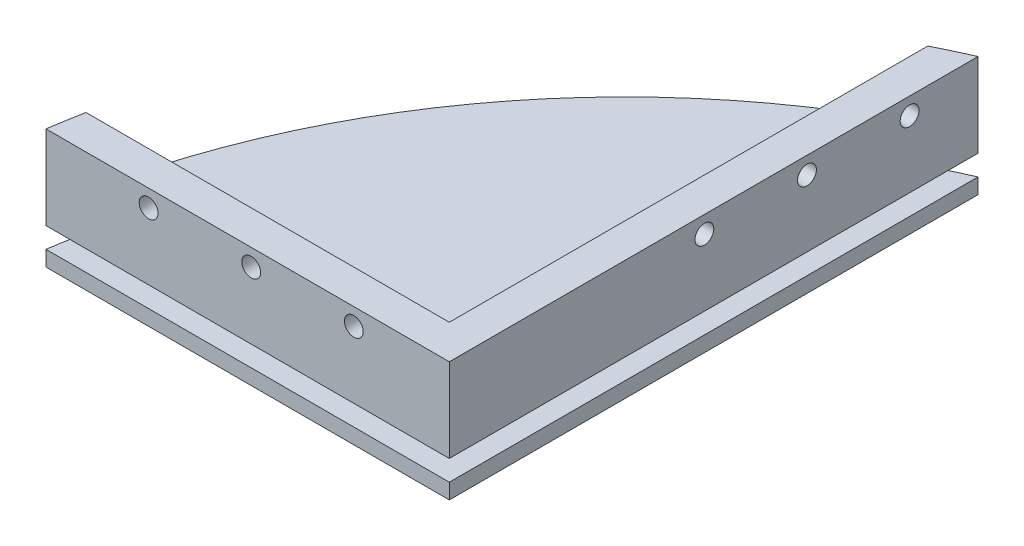
ISO-10303-21;
HEADER;
FILE_DESCRIPTION(('STEP AP214'),'2;1');
FILE_NAME('part.step','',(''),(''),'','','');
FILE_SCHEMA(('AUTOMOTIVE_DESIGN { 1 0 10303 214 1 1 1 1 }'));
ENDSEC;
DATA;
#1=APPLICATION_CONTEXT('core data for automotive mechanical design processes');
#2=APPLICATION_PROTOCOL_DEFINITION('international standard','automotive_design',2000,#1);
#3=PRODUCT_CONTEXT('',#1,'mechanical');
#4=PRODUCT('Part','Part','',(#3));
#5=PRODUCT_RELATED_PRODUCT_CATEGORY('part','',(#4));
#6=PRODUCT_DEFINITION_FORMATION('','',#4);
#7=PRODUCT_DEFINITION_CONTEXT('part definition',#1,'design');
#8=PRODUCT_DEFINITION('design','',#6,#7);
#9=PRODUCT_DEFINITION_SHAPE('','',#8);
#10=(LENGTH_UNIT() NAMED_UNIT(*) SI_UNIT(.MILLI.,.METRE.));
#11=(NAMED_UNIT(*) PLANE_ANGLE_UNIT() SI_UNIT($,.RADIAN.));
#12=(NAMED_UNIT(*) SI_UNIT($,.STERADIAN.) SOLID_ANGLE_UNIT());
#13=UNCERTAINTY_MEASURE_WITH_UNIT(LENGTH_MEASURE(1.E-05),#10,'distance_accuracy_value','');
#14=(GEOMETRIC_REPRESENTATION_CONTEXT(3) GLOBAL_UNCERTAINTY_ASSIGNED_CONTEXT((#13)) GLOBAL_UNIT_ASSIGNED_CONTEXT((#10,
#11,#12)) REPRESENTATION_CONTEXT('',''));
#15=CARTESIAN_POINT('',(0.,0.,0.));
#16=DIRECTION('',(0.,0.,1.));
#17=DIRECTION('',(1.,0.,0.));
#18=AXIS2_PLACEMENT_3D('',#15,#16,#17);
#19=CARTESIAN_POINT('',(-90.,25.,-188.72281323269));
#20=DIRECTION('',(-0.736297776529826,0.67665765663091,0.));
#21=DIRECTION('',(-0.67665765663091,-0.736297776529826,0.));
#22=AXIS2_PLACEMENT_3D('',#19,#20,#21);
#23=PLANE('',#22);
#24=DIRECTION('',(0.,0.,1.));
#25=VECTOR('',#24,1.);
#26=CARTESIAN_POINT('',(-90.,25.,-188.72281323269));
#27=LINE('',#26,#25);
#28=CARTESIAN_POINT('',(-90.,25.,-178.605710994918));
#29=VERTEX_POINT('',#28);
#30=CARTESIAN_POINT('',(-90.,25.,-38.7228132326902));
#31=VERTEX_POINT('',#30);
#32=EDGE_CURVE('E177',#29,#31,#27,.T.);
#33=ORIENTED_EDGE('',*,*,#32,.F.);
#34=CARTESIAN_POINT('',(0.,122.932535364527,0.));
#35=DIRECTION('',(-0.736297776529826,0.67665765663091,0.));
#36=DIRECTION('',(0.67665765663091,0.736297776529826,0.));
#37=AXIS2_PLACEMENT_3D('',#34,#35,#36);
#38=ELLIPSE('',#37,295.570438079137,200.);
#39=CARTESIAN_POINT('',(-99.19,15.,-173.670215926623));
#40=VERTEX_POINT('',#39);
#41=EDGE_CURVE('E296',#29,#40,#38,.T.);
#42=ORIENTED_EDGE('',*,*,#41,.T.);
#43=DIRECTION('',(0.,0.,1.));
#44=VECTOR('',#43,1.);
#45=CARTESIAN_POINT('',(-99.19,15.,-188.72281323269));
#46=LINE('',#45,#44);
#47=CARTESIAN_POINT('',(-99.19,15.,-47.9128132326902));
#48=VERTEX_POINT('',#47);
#49=EDGE_CURVE('E206',#40,#48,#46,.T.);
#50=ORIENTED_EDGE('',*,*,#49,.T.);
#51=DIRECTION('',(0.560415654853144,0.60981028819711,0.560415654853145));
#52=VECTOR('',#51,1.);
#53=CARTESIAN_POINT('',(-137.109855930672,-26.2620847994253,-85.8326691633621));
#54=LINE('',#53,#52);
#55=EDGE_CURVE('E59',#48,#31,#54,.T.);
#56=ORIENTED_EDGE('',*,*,#55,.T.);
#57=EDGE_LOOP('',(#33,#42,#50,#56));
#58=FACE_BOUND('',#57,.T.);
#59=ADVANCED_FACE('F50',(#58),#23,.T.);
#60=CARTESIAN_POINT('',(-90.,35.,-188.72281323269));
#61=DIRECTION('',(-1.,0.,0.));
#62=DIRECTION('',(0.,0.,1.));
#63=AXIS2_PLACEMENT_3D('',#60,#61,#62);
#64=PLANE('',#63);
#65=CARTESIAN_POINT('',(-90.,30.,-103.303027798234));
#66=DIRECTION('',(-1.,0.,0.));
#67=DIRECTION('',(0.,0.,1.));
#68=AXIS2_PLACEMENT_3D('',#65,#66,#67);
#69=CIRCLE('',#68,2.75000000000001);
#70=CARTESIAN_POINT('',(-90.,30.,-106.053027798234));
#71=VERTEX_POINT('',#70);
#72=EDGE_CURVE('E302',#71,#71,#69,.T.);
#73=ORIENTED_EDGE('',*,*,#72,.F.);
#74=EDGE_LOOP('',(#73));
#75=FACE_BOUND('',#74,.T.);
#76=CARTESIAN_POINT('',(-90.,30.,-133.303027798234));
#77=DIRECTION('',(-1.,0.,0.));
#78=DIRECTION('',(0.,0.,1.));
#79=AXIS2_PLACEMENT_3D('',#76,#77,#78);
#80=CIRCLE('',#79,2.75000000000001);
#81=CARTESIAN_POINT('',(-90.,30.,-136.053027798234));
#82=VERTEX_POINT('',#81);
#83=EDGE_CURVE('E306',#82,#82,#80,.T.);
#84=ORIENTED_EDGE('',*,*,#83,.F.);
#85=EDGE_LOOP('',(#84));
#86=FACE_BOUND('',#85,.T.);
#87=CARTESIAN_POINT('',(-90.,30.,-163.303027798234));
#88=DIRECTION('',(-1.,0.,0.));
#89=DIRECTION('',(0.,0.,1.));
#90=AXIS2_PLACEMENT_3D('',#87,#88,#89);
#91=CIRCLE('',#90,2.75000000000001);
#92=CARTESIAN_POINT('',(-90.,30.,-166.053027798234));
#93=VERTEX_POINT('',#92);
#94=EDGE_CURVE('E310',#93,#93,#91,.T.);
#95=ORIENTED_EDGE('',*,*,#94,.F.);
#96=EDGE_LOOP('',(#95));
#97=FACE_BOUND('',#96,.T.);
#98=DIRECTION('',(0.,0.,1.));
#99=VECTOR('',#98,1.);
#100=CARTESIAN_POINT('',(-90.,35.,-188.72281323269));
#101=LINE('',#100,#99);
#102=CARTESIAN_POINT('',(-90.,35.,-178.605710994918));
#103=VERTEX_POINT('',#102);
#104=CARTESIAN_POINT('',(-90.,35.,-38.7228132326902));
#105=VERTEX_POINT('',#104);
#106=EDGE_CURVE('E173',#103,#105,#101,.T.);
#107=ORIENTED_EDGE('',*,*,#106,.F.);
#108=DIRECTION('',(0.,1.,0.));
#109=VECTOR('',#108,1.);
#110=CARTESIAN_POINT('',(-90.,0.,-178.605710994918));
#111=LINE('',#110,#109);
#112=EDGE_CURVE('E66',#103,#29,#111,.F.);
#113=ORIENTED_EDGE('',*,*,#112,.T.);
#114=ORIENTED_EDGE('',*,*,#32,.T.);
#115=DIRECTION('',(0.,-1.,0.));
#116=VECTOR('',#115,1.);
#117=CARTESIAN_POINT('',(-90.,25.,-38.7228132326902));
#118=LINE('',#117,#116);
#119=EDGE_CURVE('E233',#105,#31,#118,.T.);
#120=ORIENTED_EDGE('',*,*,#119,.F.);
#121=EDGE_LOOP('',(#107,#113,#114,#120));
#122=FACE_BOUND('',#121,.T.);
#123=ADVANCED_FACE('F294',(#75,#86,#97,#122),#64,.T.);
#124=CARTESIAN_POINT('',(-80.,0.,-28.7228132326902));
#125=DIRECTION('',(0.,0.,1.));
#126=DIRECTION('',(1.,0.,0.));
#127=AXIS2_PLACEMENT_3D('',#124,#125,#126);
#128=PLANE('',#127);
#129=CARTESIAN_POINT('',(-167.926754128895,30.,-28.7228132326902));
#130=DIRECTION('',(0.,0.,1.));
#131=DIRECTION('',(1.,0.,0.));
#132=AXIS2_PLACEMENT_3D('',#129,#130,#131);
#133=CIRCLE('',#132,2.75000000000001);
#134=CARTESIAN_POINT('',(-165.176754128895,30.,-28.7228132326902));
#135=VERTEX_POINT('',#134);
#136=EDGE_CURVE('E343',#135,#135,#133,.T.);
#137=ORIENTED_EDGE('',*,*,#136,.F.);
#138=EDGE_LOOP('',(#137));
#139=FACE_BOUND('',#138,.T.);
#140=CARTESIAN_POINT('',(-107.926754128895,30.,-28.7228132326902));
#141=DIRECTION('',(0.,0.,1.));
#142=DIRECTION('',(1.,0.,0.));
#143=AXIS2_PLACEMENT_3D('',#140,#141,#142);
#144=CIRCLE('',#143,2.75000000000001);
#145=CARTESIAN_POINT('',(-105.176754128895,30.,-28.7228132326902));
#146=VERTEX_POINT('',#145);
#147=EDGE_CURVE('E339',#146,#146,#144,.T.);
#148=ORIENTED_EDGE('',*,*,#147,.F.);
#149=EDGE_LOOP('',(#148));
#150=FACE_BOUND('',#149,.T.);
#151=CARTESIAN_POINT('',(-137.926754128895,30.,-28.7228132326902));
#152=DIRECTION('',(0.,0.,1.));
#153=DIRECTION('',(1.,0.,0.));
#154=AXIS2_PLACEMENT_3D('',#151,#152,#153);
#155=CIRCLE('',#154,2.75000000000001);
#156=CARTESIAN_POINT('',(-135.176754128895,30.,-28.7228132326902));
#157=VERTEX_POINT('',#156);
#158=EDGE_CURVE('E331',#157,#157,#155,.T.);
#159=ORIENTED_EDGE('',*,*,#158,.F.);
#160=EDGE_LOOP('',(#159));
#161=FACE_BOUND('',#160,.T.);
#162=DIRECTION('',(-1.,0.,0.));
#163=VECTOR('',#162,1.);
#164=CARTESIAN_POINT('',(-80.,35.,-28.7228132326902));
#165=LINE('',#164,#163);
#166=CARTESIAN_POINT('',(-80.,35.,-28.7228132326902));
#167=VERTEX_POINT('',#166);
#168=CARTESIAN_POINT('',(-197.926754128895,35.,-28.7228132326902));
#169=VERTEX_POINT('',#168);
#170=EDGE_CURVE('E171',#167,#169,#165,.T.);
#171=ORIENTED_EDGE('',*,*,#170,.T.);
#172=DIRECTION('',(0.,-1.,0.));
#173=VECTOR('',#172,1.);
#174=CARTESIAN_POINT('',(-197.926754128895,15.,-28.7228132326902));
#175=LINE('',#174,#173);
#176=CARTESIAN_POINT('',(-197.926754128895,10.5,-28.7228132326902));
#177=VERTEX_POINT('',#176);
#178=EDGE_CURVE('E197',#169,#177,#175,.T.);
#179=ORIENTED_EDGE('',*,*,#178,.T.);
#180=DIRECTION('',(-1.,0.,0.));
#181=VECTOR('',#180,1.);
#182=CARTESIAN_POINT('',(-80.,10.5,-28.7228132326902));
#183=LINE('',#182,#181);
#184=CARTESIAN_POINT('',(-80.,10.5,-28.7228132326902));
#185=VERTEX_POINT('',#184);
#186=EDGE_CURVE('E281',#185,#177,#183,.T.);
#187=ORIENTED_EDGE('',*,*,#186,.F.);
#188=DIRECTION('',(0.,1.,0.));
#189=VECTOR('',#188,1.);
#190=CARTESIAN_POINT('',(-80.,0.,-28.7228132326902));
#191=LINE('',#190,#189);
#192=EDGE_CURVE('E190',#185,#167,#191,.T.);
#193=ORIENTED_EDGE('',*,*,#192,.T.);
#194=EDGE_LOOP('',(#171,#179,#187,#193));
#195=FACE_BOUND('',#194,.T.);
#196=ADVANCED_FACE('F361',(#139,#150,#161,#195),#128,.T.);
#197=CARTESIAN_POINT('',(-80.,0.,-28.7228132326902));
#198=DIRECTION('',(1.,0.,0.));
#199=DIRECTION('',(0.,0.,-1.));
#200=AXIS2_PLACEMENT_3D('',#197,#198,#199);
#201=PLANE('',#200);
#202=CARTESIAN_POINT('',(-80.,30.,-103.303027798234));
#203=DIRECTION('',(1.,0.,0.));
#204=DIRECTION('',(0.,0.,-1.));
#205=AXIS2_PLACEMENT_3D('',#202,#203,#204);
#206=CIRCLE('',#205,2.75000000000001);
#207=CARTESIAN_POINT('',(-80.,30.,-106.053027798234));
#208=VERTEX_POINT('',#207);
#209=EDGE_CURVE('E314',#208,#208,#206,.T.);
#210=ORIENTED_EDGE('',*,*,#209,.F.);
#211=EDGE_LOOP('',(#210));
#212=FACE_BOUND('',#211,.T.);
#213=CARTESIAN_POINT('',(-80.,30.,-133.303027798234));
#214=DIRECTION('',(1.,0.,0.));
#215=DIRECTION('',(0.,0.,-1.));
#216=AXIS2_PLACEMENT_3D('',#213,#214,#215);
#217=CIRCLE('',#216,2.75000000000001);
#218=CARTESIAN_POINT('',(-80.,30.,-136.053027798234));
#219=VERTEX_POINT('',#218);
#220=EDGE_CURVE('E319',#219,#219,#217,.T.);
#221=ORIENTED_EDGE('',*,*,#220,.F.);
#222=EDGE_LOOP('',(#221));
#223=FACE_BOUND('',#222,.T.);
#224=CARTESIAN_POINT('',(-80.,30.,-163.303027798234));
#225=DIRECTION('',(1.,0.,0.));
#226=DIRECTION('',(0.,0.,-1.));
#227=AXIS2_PLACEMENT_3D('',#224,#225,#226);
#228=CIRCLE('',#227,2.75000000000001);
#229=CARTESIAN_POINT('',(-80.,30.,-166.053027798234));
#230=VERTEX_POINT('',#229);
#231=EDGE_CURVE('E315',#230,#230,#228,.T.);
#232=ORIENTED_EDGE('',*,*,#231,.F.);
#233=EDGE_LOOP('',(#232));
#234=FACE_BOUND('',#233,.T.);
#235=DIRECTION('',(0.,-1.,0.));
#236=VECTOR('',#235,1.);
#237=CARTESIAN_POINT('',(-80.,15.,-183.303027798234));
#238=LINE('',#237,#236);
#239=CARTESIAN_POINT('',(-80.,10.5,-183.303027798234));
#240=VERTEX_POINT('',#239);
#241=CARTESIAN_POINT('',(-80.,35.,-183.303027798234));
#242=VERTEX_POINT('',#241);
#243=EDGE_CURVE('E148',#240,#242,#238,.F.);
#244=ORIENTED_EDGE('',*,*,#243,.T.);
#245=DIRECTION('',(0.,0.,1.));
#246=VECTOR('',#245,1.);
#247=CARTESIAN_POINT('',(-80.,35.,-188.72281323269));
#248=LINE('',#247,#246);
#249=EDGE_CURVE('E152',#242,#167,#248,.T.);
#250=ORIENTED_EDGE('',*,*,#249,.T.);
#251=ORIENTED_EDGE('',*,*,#192,.F.);
#252=DIRECTION('',(0.,0.,1.));
#253=VECTOR('',#252,1.);
#254=CARTESIAN_POINT('',(-80.,10.5,-28.7228132326902));
#255=LINE('',#254,#253);
#256=EDGE_CURVE('E154',#240,#185,#255,.T.);
#257=ORIENTED_EDGE('',*,*,#256,.F.);
#258=EDGE_LOOP('',(#244,#250,#251,#257));
#259=FACE_BOUND('',#258,.T.);
#260=ADVANCED_FACE('F149',(#212,#223,#234,#259),#201,.T.);
#261=CARTESIAN_POINT('',(-80.,35.,-188.72281323269));
#262=DIRECTION('',(0.,1.,0.));
#263=DIRECTION('',(0.,0.,1.));
#264=AXIS2_PLACEMENT_3D('',#261,#262,#263);
#265=PLANE('',#264);
#266=ORIENTED_EDGE('',*,*,#249,.F.);
#267=CARTESIAN_POINT('',(0.,35.,0.));
#268=DIRECTION('',(0.,1.,0.));
#269=DIRECTION('',(0.,0.,1.));
#270=AXIS2_PLACEMENT_3D('',#267,#268,#269);
#271=CIRCLE('',#270,200.);
#272=EDGE_CURVE('E160',#242,#103,#271,.T.);
#273=ORIENTED_EDGE('',*,*,#272,.T.);
#274=ORIENTED_EDGE('',*,*,#106,.T.);
#275=DIRECTION('',(1.,0.,0.));
#276=VECTOR('',#275,1.);
#277=CARTESIAN_POINT('',(-250.,35.,-38.7228132326902));
#278=LINE('',#277,#276);
#279=CARTESIAN_POINT('',(-196.215554264554,35.,-38.7228132326902));
#280=VERTEX_POINT('',#279);
#281=EDGE_CURVE('E237',#280,#105,#278,.T.);
#282=ORIENTED_EDGE('',*,*,#281,.F.);
#283=EDGE_CURVE('E165',#280,#169,#271,.T.);
#284=ORIENTED_EDGE('',*,*,#283,.T.);
#285=ORIENTED_EDGE('',*,*,#170,.F.);
#286=EDGE_LOOP('',(#266,#273,#274,#282,#284,#285));
#287=FACE_BOUND('',#286,.T.);
#288=ADVANCED_FACE('F168',(#287),#265,.T.);
#289=CARTESIAN_POINT('',(-250.,25.,-38.7228132326902));
#290=DIRECTION('',(0.,0.,1.));
#291=DIRECTION('',(0.,-1.,0.));
#292=AXIS2_PLACEMENT_3D('',#289,#290,#291);
#293=PLANE('',#292);
#294=CARTESIAN_POINT('',(-167.926754128895,30.,-38.7228132326902));
#295=DIRECTION('',(0.,0.,1.));
#296=DIRECTION('',(1.,0.,0.));
#297=AXIS2_PLACEMENT_3D('',#294,#295,#296);
#298=CIRCLE('',#297,2.75000000000001);
#299=CARTESIAN_POINT('',(-165.176754128895,30.,-38.7228132326902));
#300=VERTEX_POINT('',#299);
#301=EDGE_CURVE('E320',#300,#300,#298,.T.);
#302=ORIENTED_EDGE('',*,*,#301,.T.);
#303=EDGE_LOOP('',(#302));
#304=FACE_BOUND('',#303,.T.);
#305=CARTESIAN_POINT('',(-107.926754128895,30.,-38.7228132326902));
#306=DIRECTION('',(0.,0.,1.));
#307=DIRECTION('',(1.,0.,0.));
#308=AXIS2_PLACEMENT_3D('',#305,#306,#307);
#309=CIRCLE('',#308,2.75000000000001);
#310=CARTESIAN_POINT('',(-105.176754128895,30.,-38.7228132326902));
#311=VERTEX_POINT('',#310);
#312=EDGE_CURVE('E335',#311,#311,#309,.T.);
#313=ORIENTED_EDGE('',*,*,#312,.T.);
#314=EDGE_LOOP('',(#313));
#315=FACE_BOUND('',#314,.T.);
#316=CARTESIAN_POINT('',(-137.926754128895,30.,-38.7228132326902));
#317=DIRECTION('',(0.,0.,1.));
#318=DIRECTION('',(1.,0.,0.));
#319=AXIS2_PLACEMENT_3D('',#316,#317,#318);
#320=CIRCLE('',#319,2.75000000000001);
#321=CARTESIAN_POINT('',(-135.176754128895,30.,-38.7228132326902));
#322=VERTEX_POINT('',#321);
#323=EDGE_CURVE('E327',#322,#322,#320,.T.);
#324=ORIENTED_EDGE('',*,*,#323,.T.);
#325=EDGE_LOOP('',(#324));
#326=FACE_BOUND('',#325,.T.);
#327=DIRECTION('',(0.,1.,0.));
#328=VECTOR('',#327,1.);
#329=CARTESIAN_POINT('',(-196.215554264554,0.,-38.7228132326902));
#330=LINE('',#329,#328);
#331=CARTESIAN_POINT('',(-196.215554264554,25.,-38.7228132326902));
#332=VERTEX_POINT('',#331);
#333=EDGE_CURVE('E72',#280,#332,#330,.F.);
#334=ORIENTED_EDGE('',*,*,#333,.F.);
#335=ORIENTED_EDGE('',*,*,#281,.T.);
#336=ORIENTED_EDGE('',*,*,#119,.T.);
#337=DIRECTION('',(1.,0.,0.));
#338=VECTOR('',#337,1.);
#339=CARTESIAN_POINT('',(-250.,25.,-38.7228132326902));
#340=LINE('',#339,#338);
#341=EDGE_CURVE('E227',#332,#31,#340,.T.);
#342=ORIENTED_EDGE('',*,*,#341,.F.);
#343=EDGE_LOOP('',(#334,#335,#336,#342));
#344=FACE_BOUND('',#343,.T.);
#345=ADVANCED_FACE('F351',(#304,#315,#326,#344),#293,.F.);
#346=CARTESIAN_POINT('',(-250.,15.,-47.9128132326902));
#347=DIRECTION('',(0.,-0.67665765663091,0.736297776529826));
#348=DIRECTION('',(0.,-0.736297776529826,-0.67665765663091));
#349=AXIS2_PLACEMENT_3D('',#346,#347,#348);
#350=PLANE('',#349);
#351=CARTESIAN_POINT('',(0.,67.1358141813822,0.));
#352=DIRECTION('',(0.,-0.67665765663091,0.736297776529826));
#353=DIRECTION('',(0.,0.736297776529826,0.67665765663091));
#354=AXIS2_PLACEMENT_3D('',#351,#352,#353);
#355=ELLIPSE('',#354,295.570438079136,200.);
#356=CARTESIAN_POINT('',(-194.176111630987,15.,-47.9128132326902));
#357=VERTEX_POINT('',#356);
#358=EDGE_CURVE('E12',#332,#357,#355,.T.);
#359=ORIENTED_EDGE('',*,*,#358,.F.);
#360=ORIENTED_EDGE('',*,*,#341,.T.);
#361=ORIENTED_EDGE('',*,*,#55,.F.);
#362=DIRECTION('',(1.,0.,0.));
#363=VECTOR('',#362,1.);
#364=CARTESIAN_POINT('',(-250.,15.,-47.9128132326902));
#365=LINE('',#364,#363);
#366=EDGE_CURVE('E225',#357,#48,#365,.T.);
#367=ORIENTED_EDGE('',*,*,#366,.F.);
#368=EDGE_LOOP('',(#359,#360,#361,#367));
#369=FACE_BOUND('',#368,.T.);
#370=ADVANCED_FACE('F224',(#369),#350,.F.);
#371=CARTESIAN_POINT('',(0.,15.,0.));
#372=DIRECTION('',(0.,1.,0.));
#373=DIRECTION('',(0.,0.,1.));
#374=AXIS2_PLACEMENT_3D('',#371,#372,#373);
#375=PLANE('',#374);
#376=CARTESIAN_POINT('',(0.,15.,0.));
#377=DIRECTION('',(0.,1.,0.));
#378=DIRECTION('',(0.,0.,1.));
#379=AXIS2_PLACEMENT_3D('',#376,#377,#378);
#380=CIRCLE('',#379,200.);
#381=EDGE_CURVE('E202',#40,#357,#380,.T.);
#382=ORIENTED_EDGE('',*,*,#381,.T.);
#383=ORIENTED_EDGE('',*,*,#366,.T.);
#384=ORIENTED_EDGE('',*,*,#49,.F.);
#385=EDGE_LOOP('',(#382,#383,#384));
#386=FACE_BOUND('',#385,.T.);
#387=ADVANCED_FACE('F230',(#386),#375,.T.);
#388=CARTESIAN_POINT('',(0.,15.,0.));
#389=DIRECTION('',(0.,-1.,0.));
#390=DIRECTION('',(0.,0.,-1.));
#391=AXIS2_PLACEMENT_3D('',#388,#389,#390);
#392=CYLINDRICAL_SURFACE('',#391,200.);
#393=DIRECTION('',(0.,-1.,0.));
#394=VECTOR('',#393,1.);
#395=CARTESIAN_POINT('',(-196.215554264554,15.,-38.7228132326902));
#396=LINE('',#395,#394);
#397=CARTESIAN_POINT('',(-196.215554264554,4.5,-38.7228132326902));
#398=VERTEX_POINT('',#397);
#399=CARTESIAN_POINT('',(-196.215554264554,10.5,-38.7228132326902));
#400=VERTEX_POINT('',#399);
#401=EDGE_CURVE('E259',#398,#400,#396,.F.);
#402=ORIENTED_EDGE('',*,*,#401,.T.);
#403=CARTESIAN_POINT('',(0.,10.5,0.));
#404=DIRECTION('',(0.,1.,0.));
#405=DIRECTION('',(0.,0.,1.));
#406=AXIS2_PLACEMENT_3D('',#403,#404,#405);
#407=CIRCLE('',#406,200.);
#408=EDGE_CURVE('E262',#400,#177,#407,.T.);
#409=ORIENTED_EDGE('',*,*,#408,.T.);
#410=ORIENTED_EDGE('',*,*,#178,.F.);
#411=ORIENTED_EDGE('',*,*,#283,.F.);
#412=ORIENTED_EDGE('',*,*,#333,.T.);
#413=ORIENTED_EDGE('',*,*,#358,.T.);
#414=ORIENTED_EDGE('',*,*,#381,.F.);
#415=ORIENTED_EDGE('',*,*,#41,.F.);
#416=ORIENTED_EDGE('',*,*,#112,.F.);
#417=ORIENTED_EDGE('',*,*,#272,.F.);
#418=ORIENTED_EDGE('',*,*,#243,.F.);
#419=CARTESIAN_POINT('',(0.,10.5,0.));
#420=DIRECTION('',(0.,1.,0.));
#421=DIRECTION('',(0.,0.,1.));
#422=AXIS2_PLACEMENT_3D('',#419,#420,#421);
#423=CIRCLE('',#422,200.);
#424=CARTESIAN_POINT('',(-90.,10.5,-178.605710994918));
#425=VERTEX_POINT('',#424);
#426=EDGE_CURVE('E284',#240,#425,#423,.T.);
#427=ORIENTED_EDGE('',*,*,#426,.T.);
#428=DIRECTION('',(0.,-1.,0.));
#429=VECTOR('',#428,1.);
#430=CARTESIAN_POINT('',(-90.,15.,-178.605710994918));
#431=LINE('',#430,#429);
#432=CARTESIAN_POINT('',(-90.,4.5,-178.605710994918));
#433=VERTEX_POINT('',#432);
#434=EDGE_CURVE('E179',#425,#433,#431,.T.);
#435=ORIENTED_EDGE('',*,*,#434,.T.);
#436=CARTESIAN_POINT('',(0.,4.50000000000001,0.));
#437=DIRECTION('',(0.,-1.,0.));
#438=DIRECTION('',(1.,0.,0.));
#439=AXIS2_PLACEMENT_3D('',#436,#437,#438);
#440=CIRCLE('',#439,200.);
#441=CARTESIAN_POINT('',(-80.,4.5,-183.303027798234));
#442=VERTEX_POINT('',#441);
#443=EDGE_CURVE('E277',#433,#442,#440,.T.);
#444=ORIENTED_EDGE('',*,*,#443,.T.);
#445=CARTESIAN_POINT('',(-80.,0.,-183.303027798234));
#446=VERTEX_POINT('',#445);
#447=EDGE_CURVE('E157',#446,#442,#238,.F.);
#448=ORIENTED_EDGE('',*,*,#447,.F.);
#449=CARTESIAN_POINT('',(0.,0.,0.));
#450=DIRECTION('',(0.,1.,0.));
#451=DIRECTION('',(0.,0.,1.));
#452=AXIS2_PLACEMENT_3D('',#449,#450,#451);
#453=CIRCLE('',#452,200.);
#454=CARTESIAN_POINT('',(-197.926754128895,0.,-28.7228132326902));
#455=VERTEX_POINT('',#454);
#456=EDGE_CURVE('E201',#446,#455,#453,.T.);
#457=ORIENTED_EDGE('',*,*,#456,.T.);
#458=CARTESIAN_POINT('',(-197.926754128895,4.5,-28.7228132326902));
#459=VERTEX_POINT('',#458);
#460=EDGE_CURVE('E196',#459,#455,#175,.T.);
#461=ORIENTED_EDGE('',*,*,#460,.F.);
#462=CARTESIAN_POINT('',(0.,4.5,0.));
#463=DIRECTION('',(0.,-1.,0.));
#464=DIRECTION('',(0.,0.,-1.));
#465=AXIS2_PLACEMENT_3D('',#462,#463,#464);
#466=CIRCLE('',#465,200.);
#467=EDGE_CURVE('E253',#459,#398,#466,.T.);
#468=ORIENTED_EDGE('',*,*,#467,.T.);
#469=EDGE_LOOP('',(#402,#409,#410,#411,#412,#413,#414,#415,#416,#417,#418,#427,#435,#444,#448,
#457,#461,#468));
#470=FACE_BOUND('',#469,.T.);
#471=ADVANCED_FACE('F52',(#470),#392,.T.);
#472=CARTESIAN_POINT('',(0.,0.,0.));
#473=DIRECTION('',(0.,1.,0.));
#474=DIRECTION('',(0.,0.,1.));
#475=AXIS2_PLACEMENT_3D('',#472,#473,#474);
#476=PLANE('',#475);
#477=DIRECTION('',(1.,0.,0.));
#478=VECTOR('',#477,1.);
#479=CARTESIAN_POINT('',(-80.,0.,-28.7228132326902));
#480=LINE('',#479,#478);
#481=CARTESIAN_POINT('',(-80.,0.,-28.7228132326901));
#482=VERTEX_POINT('',#481);
#483=EDGE_CURVE('E183',#455,#482,#480,.T.);
#484=ORIENTED_EDGE('',*,*,#483,.F.);
#485=ORIENTED_EDGE('',*,*,#456,.F.);
#486=DIRECTION('',(0.,0.,-1.));
#487=VECTOR('',#486,1.);
#488=CARTESIAN_POINT('',(-80.,0.,-28.7228132326902));
#489=LINE('',#488,#487);
#490=EDGE_CURVE('E187',#482,#446,#489,.T.);
#491=ORIENTED_EDGE('',*,*,#490,.F.);
#492=EDGE_LOOP('',(#484,#485,#491));
#493=FACE_BOUND('',#492,.T.);
#494=ADVANCED_FACE('F380',(#493),#476,.F.);
#495=DIRECTION('',(1.,0.,0.));
#496=VECTOR('',#495,1.);
#497=CARTESIAN_POINT('',(-80.,4.5,-28.7228132326902));
#498=LINE('',#497,#496);
#499=CARTESIAN_POINT('',(-80.,4.5,-28.7228132326902));
#500=VERTEX_POINT('',#499);
#501=EDGE_CURVE('E271',#459,#500,#498,.T.);
#502=ORIENTED_EDGE('',*,*,#501,.F.);
#503=ORIENTED_EDGE('',*,*,#460,.T.);
#504=ORIENTED_EDGE('',*,*,#483,.T.);
#505=EDGE_CURVE('E158',#482,#500,#191,.T.);
#506=ORIENTED_EDGE('',*,*,#505,.T.);
#507=EDGE_LOOP('',(#502,#503,#504,#506));
#508=FACE_BOUND('',#507,.T.);
#509=ADVANCED_FACE('F365',(#508),#128,.T.);
#510=DIRECTION('',(0.,0.,-1.));
#511=VECTOR('',#510,1.);
#512=CARTESIAN_POINT('',(-80.,4.5,-28.7228132326902));
#513=LINE('',#512,#511);
#514=EDGE_CURVE('E210',#500,#442,#513,.T.);
#515=ORIENTED_EDGE('',*,*,#514,.F.);
#516=ORIENTED_EDGE('',*,*,#505,.F.);
#517=ORIENTED_EDGE('',*,*,#490,.T.);
#518=ORIENTED_EDGE('',*,*,#447,.T.);
#519=EDGE_LOOP('',(#515,#516,#517,#518));
#520=FACE_BOUND('',#519,.T.);
#521=ADVANCED_FACE('F384',(#520),#201,.T.);
#522=CARTESIAN_POINT('',(-90.,4.5,-188.72281323269));
#523=DIRECTION('',(-1.,0.,0.));
#524=DIRECTION('',(0.,0.,1.));
#525=AXIS2_PLACEMENT_3D('',#522,#523,#524);
#526=PLANE('',#525);
#527=DIRECTION('',(0.,0.,1.));
#528=VECTOR('',#527,1.);
#529=CARTESIAN_POINT('',(-90.,10.5,-188.72281323269));
#530=LINE('',#529,#528);
#531=CARTESIAN_POINT('',(-90.,10.5,-38.7228132326902));
#532=VERTEX_POINT('',#531);
#533=EDGE_CURVE('E266',#425,#532,#530,.T.);
#534=ORIENTED_EDGE('',*,*,#533,.T.);
#535=DIRECTION('',(0.,1.,0.));
#536=VECTOR('',#535,1.);
#537=CARTESIAN_POINT('',(-90.,4.5,-38.7228132326902));
#538=LINE('',#537,#536);
#539=CARTESIAN_POINT('',(-90.,4.5,-38.7228132326902));
#540=VERTEX_POINT('',#539);
#541=EDGE_CURVE('E245',#540,#532,#538,.T.);
#542=ORIENTED_EDGE('',*,*,#541,.F.);
#543=DIRECTION('',(0.,0.,1.));
#544=VECTOR('',#543,1.);
#545=CARTESIAN_POINT('',(-90.,4.5,-188.72281323269));
#546=LINE('',#545,#544);
#547=EDGE_CURVE('E267',#433,#540,#546,.T.);
#548=ORIENTED_EDGE('',*,*,#547,.F.);
#549=ORIENTED_EDGE('',*,*,#434,.F.);
#550=EDGE_LOOP('',(#534,#542,#548,#549));
#551=FACE_BOUND('',#550,.T.);
#552=ADVANCED_FACE('F397',(#551),#526,.F.);
#553=CARTESIAN_POINT('',(-90.,10.5,-188.72281323269));
#554=DIRECTION('',(0.,1.,0.));
#555=DIRECTION('',(0.,0.,1.));
#556=AXIS2_PLACEMENT_3D('',#553,#554,#555);
#557=PLANE('',#556);
#558=ORIENTED_EDGE('',*,*,#256,.T.);
#559=ORIENTED_EDGE('',*,*,#186,.T.);
#560=ORIENTED_EDGE('',*,*,#408,.F.);
#561=DIRECTION('',(1.,0.,0.));
#562=VECTOR('',#561,1.);
#563=CARTESIAN_POINT('',(-250.,10.5,-38.7228132326902));
#564=LINE('',#563,#562);
#565=EDGE_CURVE('E250',#400,#532,#564,.T.);
#566=ORIENTED_EDGE('',*,*,#565,.T.);
#567=ORIENTED_EDGE('',*,*,#533,.F.);
#568=ORIENTED_EDGE('',*,*,#426,.F.);
#569=EDGE_LOOP('',(#558,#559,#560,#566,#567,#568));
#570=FACE_BOUND('',#569,.T.);
#571=ADVANCED_FACE('F395',(#570),#557,.F.);
#572=CARTESIAN_POINT('',(-80.,4.5,-188.72281323269));
#573=DIRECTION('',(0.,-1.,0.));
#574=DIRECTION('',(1.,0.,0.));
#575=AXIS2_PLACEMENT_3D('',#572,#573,#574);
#576=PLANE('',#575);
#577=ORIENTED_EDGE('',*,*,#547,.T.);
#578=DIRECTION('',(1.,0.,0.));
#579=VECTOR('',#578,1.);
#580=CARTESIAN_POINT('',(-250.,4.5,-38.7228132326902));
#581=LINE('',#580,#579);
#582=EDGE_CURVE('E249',#398,#540,#581,.T.);
#583=ORIENTED_EDGE('',*,*,#582,.F.);
#584=ORIENTED_EDGE('',*,*,#467,.F.);
#585=ORIENTED_EDGE('',*,*,#501,.T.);
#586=ORIENTED_EDGE('',*,*,#514,.T.);
#587=ORIENTED_EDGE('',*,*,#443,.F.);
#588=EDGE_LOOP('',(#577,#583,#584,#585,#586,#587));
#589=FACE_BOUND('',#588,.T.);
#590=ADVANCED_FACE('F386',(#589),#576,.F.);
#591=CARTESIAN_POINT('',(-250.,4.5,-38.7228132326902));
#592=DIRECTION('',(0.,0.,-1.));
#593=DIRECTION('',(0.,1.,0.));
#594=AXIS2_PLACEMENT_3D('',#591,#592,#593);
#595=PLANE('',#594);
#596=ORIENTED_EDGE('',*,*,#582,.T.);
#597=ORIENTED_EDGE('',*,*,#541,.T.);
#598=ORIENTED_EDGE('',*,*,#565,.F.);
#599=ORIENTED_EDGE('',*,*,#401,.F.);
#600=EDGE_LOOP('',(#596,#597,#598,#599));
#601=FACE_BOUND('',#600,.T.);
#602=ADVANCED_FACE('F391',(#601),#595,.F.);
#603=CARTESIAN_POINT('',(-197.926754128895,30.,-163.303027798234));
#604=DIRECTION('',(1.,0.,0.));
#605=DIRECTION('',(0.,0.,-1.));
#606=AXIS2_PLACEMENT_3D('',#603,#604,#605);
#607=CYLINDRICAL_SURFACE('',#606,2.75000000000001);
#608=CARTESIAN_POINT('',(-90.,30.,-166.053027798234));
#609=CARTESIAN_POINT('',(-89.8958333333333,30.,-166.053027798234));
#610=CARTESIAN_POINT('',(-89.7916666666667,30.,-166.053027798234));
#611=CARTESIAN_POINT('',(-89.5833333333333,30.,-166.053027798234));
#612=CARTESIAN_POINT('',(-89.4791666666667,30.,-166.053027798234));
#613=CARTESIAN_POINT('',(-89.2708333333333,30.,-166.053027798234));
#614=CARTESIAN_POINT('',(-89.1666666666667,30.,-166.053027798234));
#615=CARTESIAN_POINT('',(-88.9583333333333,30.,-166.053027798234));
#616=CARTESIAN_POINT('',(-88.8541666666667,30.,-166.053027798234));
#617=CARTESIAN_POINT('',(-88.6458333333333,30.,-166.053027798234));
#618=CARTESIAN_POINT('',(-88.5416666666667,30.,-166.053027798234));
#619=CARTESIAN_POINT('',(-88.3333333333333,30.,-166.053027798234));
#620=CARTESIAN_POINT('',(-88.2291666666667,30.,-166.053027798234));
#621=CARTESIAN_POINT('',(-88.0208333333333,30.,-166.053027798234));
#622=CARTESIAN_POINT('',(-87.9166666666667,30.,-166.053027798234));
#623=CARTESIAN_POINT('',(-87.7083333333333,30.,-166.053027798234));
#624=CARTESIAN_POINT('',(-87.6041666666667,30.,-166.053027798234));
#625=CARTESIAN_POINT('',(-87.3958333333333,30.,-166.053027798234));
#626=CARTESIAN_POINT('',(-87.2916666666667,30.,-166.053027798234));
#627=CARTESIAN_POINT('',(-87.0833333333333,30.,-166.053027798234));
#628=CARTESIAN_POINT('',(-86.9791666666667,30.,-166.053027798234));
#629=CARTESIAN_POINT('',(-86.7708333333334,30.,-166.053027798234));
#630=CARTESIAN_POINT('',(-86.6666666666667,30.,-166.053027798234));
#631=CARTESIAN_POINT('',(-86.4583333333333,30.,-166.053027798234));
#632=CARTESIAN_POINT('',(-86.3541666666667,30.,-166.053027798234));
#633=CARTESIAN_POINT('',(-86.1458333333334,30.,-166.053027798234));
#634=CARTESIAN_POINT('',(-86.0416666666667,30.,-166.053027798234));
#635=CARTESIAN_POINT('',(-85.8333333333333,30.,-166.053027798234));
#636=CARTESIAN_POINT('',(-85.7291666666667,30.,-166.053027798234));
#637=CARTESIAN_POINT('',(-85.5208333333334,30.,-166.053027798234));
#638=CARTESIAN_POINT('',(-85.4166666666667,30.,-166.053027798234));
#639=CARTESIAN_POINT('',(-85.2083333333333,30.,-166.053027798234));
#640=CARTESIAN_POINT('',(-85.1041666666667,30.,-166.053027798234));
#641=CARTESIAN_POINT('',(-84.8958333333334,30.,-166.053027798234));
#642=CARTESIAN_POINT('',(-84.7916666666667,30.,-166.053027798234));
#643=CARTESIAN_POINT('',(-84.5833333333334,30.,-166.053027798234));
#644=CARTESIAN_POINT('',(-84.4791666666667,30.,-166.053027798234));
#645=CARTESIAN_POINT('',(-84.2708333333334,30.,-166.053027798234));
#646=CARTESIAN_POINT('',(-84.1666666666667,30.,-166.053027798234));
#647=CARTESIAN_POINT('',(-83.9583333333334,30.,-166.053027798234));
#648=CARTESIAN_POINT('',(-83.8541666666667,30.,-166.053027798234));
#649=CARTESIAN_POINT('',(-83.6458333333333,30.,-166.053027798234));
#650=CARTESIAN_POINT('',(-83.5416666666667,30.,-166.053027798234));
#651=CARTESIAN_POINT('',(-83.3333333333334,30.,-166.053027798234));
#652=CARTESIAN_POINT('',(-83.2291666666667,30.,-166.053027798234));
#653=CARTESIAN_POINT('',(-83.0208333333333,30.,-166.053027798234));
#654=CARTESIAN_POINT('',(-82.9166666666667,30.,-166.053027798234));
#655=CARTESIAN_POINT('',(-82.7083333333334,30.,-166.053027798234));
#656=CARTESIAN_POINT('',(-82.6041666666667,30.,-166.053027798234));
#657=CARTESIAN_POINT('',(-82.3958333333334,30.,-166.053027798234));
#658=CARTESIAN_POINT('',(-82.2916666666667,30.,-166.053027798234));
#659=CARTESIAN_POINT('',(-82.0833333333334,30.,-166.053027798234));
#660=CARTESIAN_POINT('',(-81.9791666666667,30.,-166.053027798234));
#661=CARTESIAN_POINT('',(-81.7708333333334,30.,-166.053027798234));
#662=CARTESIAN_POINT('',(-81.6666666666667,30.,-166.053027798234));
#663=CARTESIAN_POINT('',(-81.4583333333334,30.,-166.053027798234));
#664=CARTESIAN_POINT('',(-81.3541666666667,30.,-166.053027798234));
#665=CARTESIAN_POINT('',(-81.1458333333334,30.,-166.053027798234));
#666=CARTESIAN_POINT('',(-81.0416666666667,30.,-166.053027798234));
#667=CARTESIAN_POINT('',(-80.8333333333334,30.,-166.053027798234));
#668=CARTESIAN_POINT('',(-80.7291666666667,30.,-166.053027798234));
#669=CARTESIAN_POINT('',(-80.5208333333334,30.,-166.053027798234));
#670=CARTESIAN_POINT('',(-80.4166666666667,30.,-166.053027798234));
#671=CARTESIAN_POINT('',(-80.2083333333334,30.,-166.053027798234));
#672=CARTESIAN_POINT('',(-80.1041666666667,30.,-166.053027798234));
#673=CARTESIAN_POINT('',(-80.,30.,-166.053027798234));
#674=B_SPLINE_CURVE_WITH_KNOTS('',3,(#608,#609,#610,#611,#612,#613,#614,#615,#616,#617,#618,
#619,#620,#621,#622,#623,#624,#625,#626,#627,#628,#629,#630,#631,#632,#633,#634,#635,#636,#637,
#638,#639,#640,#641,#642,#643,#644,#645,#646,#647,#648,#649,#650,#651,#652,#653,#654,#655,#656,
#657,#658,#659,#660,#661,#662,#663,#664,#665,#666,#667,#668,#669,#670,#671,#672,#673),
.UNSPECIFIED.,.F.,.F.,(4,2,2,2,2,2,2,2,2,2,2,2,2,2,2,2,2,2,2,2,2,2,2,2,2,2,2,2,2,2,2,2,4),(0.,
0.312499999999993,0.625000000000001,0.937499999999994,1.25,1.56249999999999,1.875,2.1875,2.5,
2.8125,3.12499999999999,3.4375,3.74999999999999,4.0625,4.37499999999999,4.6875,4.99999999999999,
5.31249999999998,5.62499999999999,5.93749999999998,6.24999999999999,6.56249999999998,
6.87499999999999,7.18749999999999,7.49999999999998,7.81249999999999,8.12499999999998,
8.43749999999999,8.74999999999998,9.06249999999999,9.37499999999998,9.68749999999999,
9.99999999999998),.UNSPECIFIED.);
#675=EDGE_CURVE('BSEAM448',#93,#230,#674,.T.);
#676=ORIENTED_EDGE('',*,*,#94,.T.);
#677=ORIENTED_EDGE('',*,*,#231,.T.);
#678=ORIENTED_EDGE('',*,*,#675,.T.);
#679=ORIENTED_EDGE('',*,*,#675,.F.);
#680=EDGE_LOOP('',(#676,#678,#677,#679));
#681=FACE_BOUND('',#680,.T.);
#682=ADVANCED_FACE('F448',(#681),#607,.F.);
#683=CARTESIAN_POINT('',(-197.926754128895,30.,-133.303027798234));
#684=DIRECTION('',(1.,0.,0.));
#685=DIRECTION('',(0.,0.,-1.));
#686=AXIS2_PLACEMENT_3D('',#683,#684,#685);
#687=CYLINDRICAL_SURFACE('',#686,2.75000000000001);
#688=CARTESIAN_POINT('',(-90.,30.,-136.053027798234));
#689=CARTESIAN_POINT('',(-89.8958333333333,30.,-136.053027798234));
#690=CARTESIAN_POINT('',(-89.7916666666667,30.,-136.053027798234));
#691=CARTESIAN_POINT('',(-89.5833333333333,30.,-136.053027798234));
#692=CARTESIAN_POINT('',(-89.4791666666667,30.,-136.053027798234));
#693=CARTESIAN_POINT('',(-89.2708333333333,30.,-136.053027798234));
#694=CARTESIAN_POINT('',(-89.1666666666667,30.,-136.053027798234));
#695=CARTESIAN_POINT('',(-88.9583333333333,30.,-136.053027798234));
#696=CARTESIAN_POINT('',(-88.8541666666667,30.,-136.053027798234));
#697=CARTESIAN_POINT('',(-88.6458333333333,30.,-136.053027798234));
#698=CARTESIAN_POINT('',(-88.5416666666667,30.,-136.053027798234));
#699=CARTESIAN_POINT('',(-88.3333333333333,30.,-136.053027798234));
#700=CARTESIAN_POINT('',(-88.2291666666667,30.,-136.053027798234));
#701=CARTESIAN_POINT('',(-88.0208333333333,30.,-136.053027798234));
#702=CARTESIAN_POINT('',(-87.9166666666667,30.,-136.053027798234));
#703=CARTESIAN_POINT('',(-87.7083333333333,30.,-136.053027798234));
#704=CARTESIAN_POINT('',(-87.6041666666667,30.,-136.053027798234));
#705=CARTESIAN_POINT('',(-87.3958333333333,30.,-136.053027798234));
#706=CARTESIAN_POINT('',(-87.2916666666667,30.,-136.053027798234));
#707=CARTESIAN_POINT('',(-87.0833333333333,30.,-136.053027798234));
#708=CARTESIAN_POINT('',(-86.9791666666667,30.,-136.053027798234));
#709=CARTESIAN_POINT('',(-86.7708333333334,30.,-136.053027798234));
#710=CARTESIAN_POINT('',(-86.6666666666667,30.,-136.053027798234));
#711=CARTESIAN_POINT('',(-86.4583333333333,30.,-136.053027798234));
#712=CARTESIAN_POINT('',(-86.3541666666667,30.,-136.053027798234));
#713=CARTESIAN_POINT('',(-86.1458333333334,30.,-136.053027798234));
#714=CARTESIAN_POINT('',(-86.0416666666667,30.,-136.053027798234));
#715=CARTESIAN_POINT('',(-85.8333333333333,30.,-136.053027798234));
#716=CARTESIAN_POINT('',(-85.7291666666667,30.,-136.053027798234));
#717=CARTESIAN_POINT('',(-85.5208333333334,30.,-136.053027798234));
#718=CARTESIAN_POINT('',(-85.4166666666667,30.,-136.053027798234));
#719=CARTESIAN_POINT('',(-85.2083333333333,30.,-136.053027798234));
#720=CARTESIAN_POINT('',(-85.1041666666667,30.,-136.053027798234));
#721=CARTESIAN_POINT('',(-84.8958333333334,30.,-136.053027798234));
#722=CARTESIAN_POINT('',(-84.7916666666667,30.,-136.053027798234));
#723=CARTESIAN_POINT('',(-84.5833333333334,30.,-136.053027798234));
#724=CARTESIAN_POINT('',(-84.4791666666667,30.,-136.053027798234));
#725=CARTESIAN_POINT('',(-84.2708333333334,30.,-136.053027798234));
#726=CARTESIAN_POINT('',(-84.1666666666667,30.,-136.053027798234));
#727=CARTESIAN_POINT('',(-83.9583333333334,30.,-136.053027798234));
#728=CARTESIAN_POINT('',(-83.8541666666667,30.,-136.053027798234));
#729=CARTESIAN_POINT('',(-83.6458333333333,30.,-136.053027798234));
#730=CARTESIAN_POINT('',(-83.5416666666667,30.,-136.053027798234));
#731=CARTESIAN_POINT('',(-83.3333333333334,30.,-136.053027798234));
#732=CARTESIAN_POINT('',(-83.2291666666667,30.,-136.053027798234));
#733=CARTESIAN_POINT('',(-83.0208333333333,30.,-136.053027798234));
#734=CARTESIAN_POINT('',(-82.9166666666667,30.,-136.053027798234));
#735=CARTESIAN_POINT('',(-82.7083333333334,30.,-136.053027798234));
#736=CARTESIAN_POINT('',(-82.6041666666667,30.,-136.053027798234));
#737=CARTESIAN_POINT('',(-82.3958333333334,30.,-136.053027798234));
#738=CARTESIAN_POINT('',(-82.2916666666667,30.,-136.053027798234));
#739=CARTESIAN_POINT('',(-82.0833333333334,30.,-136.053027798234));
#740=CARTESIAN_POINT('',(-81.9791666666667,30.,-136.053027798234));
#741=CARTESIAN_POINT('',(-81.7708333333334,30.,-136.053027798234));
#742=CARTESIAN_POINT('',(-81.6666666666667,30.,-136.053027798234));
#743=CARTESIAN_POINT('',(-81.4583333333334,30.,-136.053027798234));
#744=CARTESIAN_POINT('',(-81.3541666666667,30.,-136.053027798234));
#745=CARTESIAN_POINT('',(-81.1458333333334,30.,-136.053027798234));
#746=CARTESIAN_POINT('',(-81.0416666666667,30.,-136.053027798234));
#747=CARTESIAN_POINT('',(-80.8333333333334,30.,-136.053027798234));
#748=CARTESIAN_POINT('',(-80.7291666666667,30.,-136.053027798234));
#749=CARTESIAN_POINT('',(-80.5208333333334,30.,-136.053027798234));
#750=CARTESIAN_POINT('',(-80.4166666666667,30.,-136.053027798234));
#751=CARTESIAN_POINT('',(-80.2083333333334,30.,-136.053027798234));
#752=CARTESIAN_POINT('',(-80.1041666666667,30.,-136.053027798234));
#753=CARTESIAN_POINT('',(-80.,30.,-136.053027798234));
#754=B_SPLINE_CURVE_WITH_KNOTS('',3,(#688,#689,#690,#691,#692,#693,#694,#695,#696,#697,#698,
#699,#700,#701,#702,#703,#704,#705,#706,#707,#708,#709,#710,#711,#712,#713,#714,#715,#716,#717,
#718,#719,#720,#721,#722,#723,#724,#725,#726,#727,#728,#729,#730,#731,#732,#733,#734,#735,#736,
#737,#738,#739,#740,#741,#742,#743,#744,#745,#746,#747,#748,#749,#750,#751,#752,#753),
.UNSPECIFIED.,.F.,.F.,(4,2,2,2,2,2,2,2,2,2,2,2,2,2,2,2,2,2,2,2,2,2,2,2,2,2,2,2,2,2,2,2,4),(0.,
0.312499999999993,0.625000000000001,0.937499999999994,1.25,1.56249999999999,1.875,2.1875,2.5,
2.8125,3.12499999999999,3.4375,3.74999999999999,4.0625,4.37499999999999,4.6875,4.99999999999999,
5.31249999999998,5.62499999999999,5.93749999999998,6.24999999999999,6.56249999999998,
6.87499999999999,7.18749999999999,7.49999999999998,7.81249999999999,8.12499999999998,
8.43749999999999,8.74999999999998,9.06249999999999,9.37499999999998,9.68749999999999,
9.99999999999998),.UNSPECIFIED.);
#755=EDGE_CURVE('BSEAM451',#82,#219,#754,.T.);
#756=ORIENTED_EDGE('',*,*,#83,.T.);
#757=ORIENTED_EDGE('',*,*,#220,.T.);
#758=ORIENTED_EDGE('',*,*,#755,.T.);
#759=ORIENTED_EDGE('',*,*,#755,.F.);
#760=EDGE_LOOP('',(#756,#758,#757,#759));
#761=FACE_BOUND('',#760,.T.);
#762=ADVANCED_FACE('F451',(#761),#687,.F.);
#763=CARTESIAN_POINT('',(-197.926754128895,30.,-103.303027798234));
#764=DIRECTION('',(1.,0.,0.));
#765=DIRECTION('',(0.,0.,-1.));
#766=AXIS2_PLACEMENT_3D('',#763,#764,#765);
#767=CYLINDRICAL_SURFACE('',#766,2.75000000000001);
#768=CARTESIAN_POINT('',(-90.,30.,-106.053027798234));
#769=CARTESIAN_POINT('',(-89.8958333333333,30.,-106.053027798234));
#770=CARTESIAN_POINT('',(-89.7916666666667,30.,-106.053027798234));
#771=CARTESIAN_POINT('',(-89.5833333333333,30.,-106.053027798234));
#772=CARTESIAN_POINT('',(-89.4791666666667,30.,-106.053027798234));
#773=CARTESIAN_POINT('',(-89.2708333333333,30.,-106.053027798234));
#774=CARTESIAN_POINT('',(-89.1666666666667,30.,-106.053027798234));
#775=CARTESIAN_POINT('',(-88.9583333333333,30.,-106.053027798234));
#776=CARTESIAN_POINT('',(-88.8541666666667,30.,-106.053027798234));
#777=CARTESIAN_POINT('',(-88.6458333333333,30.,-106.053027798234));
#778=CARTESIAN_POINT('',(-88.5416666666667,30.,-106.053027798234));
#779=CARTESIAN_POINT('',(-88.3333333333333,30.,-106.053027798234));
#780=CARTESIAN_POINT('',(-88.2291666666667,30.,-106.053027798234));
#781=CARTESIAN_POINT('',(-88.0208333333333,30.,-106.053027798234));
#782=CARTESIAN_POINT('',(-87.9166666666667,30.,-106.053027798234));
#783=CARTESIAN_POINT('',(-87.7083333333333,30.,-106.053027798234));
#784=CARTESIAN_POINT('',(-87.6041666666667,30.,-106.053027798234));
#785=CARTESIAN_POINT('',(-87.3958333333333,30.,-106.053027798234));
#786=CARTESIAN_POINT('',(-87.2916666666667,30.,-106.053027798234));
#787=CARTESIAN_POINT('',(-87.0833333333333,30.,-106.053027798234));
#788=CARTESIAN_POINT('',(-86.9791666666667,30.,-106.053027798234));
#789=CARTESIAN_POINT('',(-86.7708333333334,30.,-106.053027798234));
#790=CARTESIAN_POINT('',(-86.6666666666667,30.,-106.053027798234));
#791=CARTESIAN_POINT('',(-86.4583333333333,30.,-106.053027798234));
#792=CARTESIAN_POINT('',(-86.3541666666667,30.,-106.053027798234));
#793=CARTESIAN_POINT('',(-86.1458333333334,30.,-106.053027798234));
#794=CARTESIAN_POINT('',(-86.0416666666667,30.,-106.053027798234));
#795=CARTESIAN_POINT('',(-85.8333333333333,30.,-106.053027798234));
#796=CARTESIAN_POINT('',(-85.7291666666667,30.,-106.053027798234));
#797=CARTESIAN_POINT('',(-85.5208333333334,30.,-106.053027798234));
#798=CARTESIAN_POINT('',(-85.4166666666667,30.,-106.053027798234));
#799=CARTESIAN_POINT('',(-85.2083333333333,30.,-106.053027798234));
#800=CARTESIAN_POINT('',(-85.1041666666667,30.,-106.053027798234));
#801=CARTESIAN_POINT('',(-84.8958333333334,30.,-106.053027798234));
#802=CARTESIAN_POINT('',(-84.7916666666667,30.,-106.053027798234));
#803=CARTESIAN_POINT('',(-84.5833333333334,30.,-106.053027798234));
#804=CARTESIAN_POINT('',(-84.4791666666667,30.,-106.053027798234));
#805=CARTESIAN_POINT('',(-84.2708333333334,30.,-106.053027798234));
#806=CARTESIAN_POINT('',(-84.1666666666667,30.,-106.053027798234));
#807=CARTESIAN_POINT('',(-83.9583333333334,30.,-106.053027798234));
#808=CARTESIAN_POINT('',(-83.8541666666667,30.,-106.053027798234));
#809=CARTESIAN_POINT('',(-83.6458333333333,30.,-106.053027798234));
#810=CARTESIAN_POINT('',(-83.5416666666667,30.,-106.053027798234));
#811=CARTESIAN_POINT('',(-83.3333333333334,30.,-106.053027798234));
#812=CARTESIAN_POINT('',(-83.2291666666667,30.,-106.053027798234));
#813=CARTESIAN_POINT('',(-83.0208333333333,30.,-106.053027798234));
#814=CARTESIAN_POINT('',(-82.9166666666667,30.,-106.053027798234));
#815=CARTESIAN_POINT('',(-82.7083333333334,30.,-106.053027798234));
#816=CARTESIAN_POINT('',(-82.6041666666667,30.,-106.053027798234));
#817=CARTESIAN_POINT('',(-82.3958333333334,30.,-106.053027798234));
#818=CARTESIAN_POINT('',(-82.2916666666667,30.,-106.053027798234));
#819=CARTESIAN_POINT('',(-82.0833333333334,30.,-106.053027798234));
#820=CARTESIAN_POINT('',(-81.9791666666667,30.,-106.053027798234));
#821=CARTESIAN_POINT('',(-81.7708333333334,30.,-106.053027798234));
#822=CARTESIAN_POINT('',(-81.6666666666667,30.,-106.053027798234));
#823=CARTESIAN_POINT('',(-81.4583333333334,30.,-106.053027798234));
#824=CARTESIAN_POINT('',(-81.3541666666667,30.,-106.053027798234));
#825=CARTESIAN_POINT('',(-81.1458333333334,30.,-106.053027798234));
#826=CARTESIAN_POINT('',(-81.0416666666667,30.,-106.053027798234));
#827=CARTESIAN_POINT('',(-80.8333333333334,30.,-106.053027798234));
#828=CARTESIAN_POINT('',(-80.7291666666667,30.,-106.053027798234));
#829=CARTESIAN_POINT('',(-80.5208333333334,30.,-106.053027798234));
#830=CARTESIAN_POINT('',(-80.4166666666667,30.,-106.053027798234));
#831=CARTESIAN_POINT('',(-80.2083333333334,30.,-106.053027798234));
#832=CARTESIAN_POINT('',(-80.1041666666667,30.,-106.053027798234));
#833=CARTESIAN_POINT('',(-80.,30.,-106.053027798234));
#834=B_SPLINE_CURVE_WITH_KNOTS('',3,(#768,#769,#770,#771,#772,#773,#774,#775,#776,#777,#778,
#779,#780,#781,#782,#783,#784,#785,#786,#787,#788,#789,#790,#791,#792,#793,#794,#795,#796,#797,
#798,#799,#800,#801,#802,#803,#804,#805,#806,#807,#808,#809,#810,#811,#812,#813,#814,#815,#816,
#817,#818,#819,#820,#821,#822,#823,#824,#825,#826,#827,#828,#829,#830,#831,#832,#833),
.UNSPECIFIED.,.F.,.F.,(4,2,2,2,2,2,2,2,2,2,2,2,2,2,2,2,2,2,2,2,2,2,2,2,2,2,2,2,2,2,2,2,4),(0.,
0.312499999999993,0.625000000000001,0.937499999999994,1.25,1.56249999999999,1.875,2.1875,2.5,
2.8125,3.12499999999999,3.4375,3.74999999999999,4.0625,4.37499999999999,4.6875,4.99999999999999,
5.31249999999998,5.62499999999999,5.93749999999998,6.24999999999999,6.56249999999998,
6.87499999999999,7.18749999999999,7.49999999999998,7.81249999999999,8.12499999999998,
8.43749999999999,8.74999999999998,9.06249999999999,9.37499999999998,9.68749999999999,
9.99999999999998),.UNSPECIFIED.);
#835=EDGE_CURVE('BSEAM460',#71,#208,#834,.T.);
#836=ORIENTED_EDGE('',*,*,#72,.T.);
#837=ORIENTED_EDGE('',*,*,#209,.T.);
#838=ORIENTED_EDGE('',*,*,#835,.T.);
#839=ORIENTED_EDGE('',*,*,#835,.F.);
#840=EDGE_LOOP('',(#836,#838,#837,#839));
#841=FACE_BOUND('',#840,.T.);
#842=ADVANCED_FACE('F460',(#841),#767,.F.);
#843=CARTESIAN_POINT('',(-137.926754128895,30.,-38.7228132326902));
#844=DIRECTION('',(0.,0.,1.));
#845=DIRECTION('',(1.,0.,0.));
#846=AXIS2_PLACEMENT_3D('',#843,#844,#845);
#847=CYLINDRICAL_SURFACE('',#846,2.75000000000001);
#848=ORIENTED_EDGE('',*,*,#323,.F.);
#849=EDGE_LOOP('',(#848));
#850=FACE_BOUND('',#849,.T.);
#851=ORIENTED_EDGE('',*,*,#158,.T.);
#852=EDGE_LOOP('',(#851));
#853=FACE_BOUND('',#852,.T.);
#854=ADVANCED_FACE('F468',(#850,#853),#847,.F.);
#855=CARTESIAN_POINT('',(-107.926754128895,30.,-38.7228132326902));
#856=DIRECTION('',(0.,0.,1.));
#857=DIRECTION('',(1.,0.,0.));
#858=AXIS2_PLACEMENT_3D('',#855,#856,#857);
#859=CYLINDRICAL_SURFACE('',#858,2.75000000000001);
#860=ORIENTED_EDGE('',*,*,#312,.F.);
#861=EDGE_LOOP('',(#860));
#862=FACE_BOUND('',#861,.T.);
#863=ORIENTED_EDGE('',*,*,#147,.T.);
#864=EDGE_LOOP('',(#863));
#865=FACE_BOUND('',#864,.T.);
#866=ADVANCED_FACE('F357',(#862,#865),#859,.F.);
#867=CARTESIAN_POINT('',(-167.926754128895,30.,-38.7228132326902));
#868=DIRECTION('',(0.,0.,1.));
#869=DIRECTION('',(1.,0.,0.));
#870=AXIS2_PLACEMENT_3D('',#867,#868,#869);
#871=CYLINDRICAL_SURFACE('',#870,2.75000000000001);
#872=ORIENTED_EDGE('',*,*,#301,.F.);
#873=EDGE_LOOP('',(#872));
#874=FACE_BOUND('',#873,.T.);
#875=ORIENTED_EDGE('',*,*,#136,.T.);
#876=EDGE_LOOP('',(#875));
#877=FACE_BOUND('',#876,.T.);
#878=ADVANCED_FACE('F354',(#874,#877),#871,.F.);
#879=CLOSED_SHELL('',(#59,#123,#196,#260,#288,#345,#370,#387,#471,#494,#509,#521,#552,#571,#590,
#602,#682,#762,#842,#854,#866,#878));
#880=MANIFOLD_SOLID_BREP('B2',#879);
#881=ADVANCED_BREP_SHAPE_REPRESENTATION('',(#18,#880),#14);
#882=SHAPE_DEFINITION_REPRESENTATION(#9,#881);
ENDSEC;
END-ISO-10303-21;
